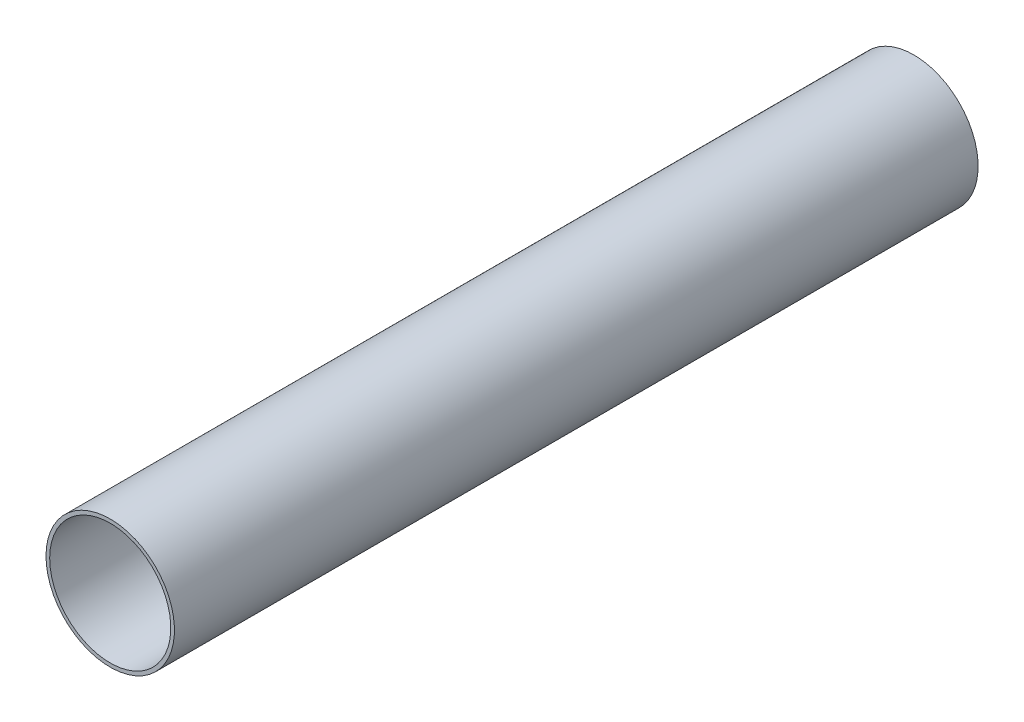
ISO-10303-21;
HEADER;
FILE_DESCRIPTION(('STEP AP214'),'2;1');
FILE_NAME('part.step','',(''),(''),'','','');
FILE_SCHEMA(('AUTOMOTIVE_DESIGN { 1 0 10303 214 1 1 1 1 }'));
ENDSEC;
DATA;
#1=APPLICATION_CONTEXT('core data for automotive mechanical design processes');
#2=APPLICATION_PROTOCOL_DEFINITION('international standard','automotive_design',2000,#1);
#3=PRODUCT_CONTEXT('',#1,'mechanical');
#4=PRODUCT('Part','Part','',(#3));
#5=PRODUCT_RELATED_PRODUCT_CATEGORY('part','',(#4));
#6=PRODUCT_DEFINITION_FORMATION('','',#4);
#7=PRODUCT_DEFINITION_CONTEXT('part definition',#1,'design');
#8=PRODUCT_DEFINITION('design','',#6,#7);
#9=PRODUCT_DEFINITION_SHAPE('','',#8);
#10=(LENGTH_UNIT() NAMED_UNIT(*) SI_UNIT(.MILLI.,.METRE.));
#11=(NAMED_UNIT(*) PLANE_ANGLE_UNIT() SI_UNIT($,.RADIAN.));
#12=(NAMED_UNIT(*) SI_UNIT($,.STERADIAN.) SOLID_ANGLE_UNIT());
#13=UNCERTAINTY_MEASURE_WITH_UNIT(LENGTH_MEASURE(1.E-05),#10,'distance_accuracy_value','');
#14=(GEOMETRIC_REPRESENTATION_CONTEXT(3) GLOBAL_UNCERTAINTY_ASSIGNED_CONTEXT((#13)) GLOBAL_UNIT_ASSIGNED_CONTEXT((#10,
#11,#12)) REPRESENTATION_CONTEXT('',''));
#15=CARTESIAN_POINT('',(0.,0.,0.));
#16=DIRECTION('',(0.,0.,1.));
#17=DIRECTION('',(1.,0.,0.));
#18=AXIS2_PLACEMENT_3D('',#15,#16,#17);
#19=CARTESIAN_POINT('',(0.,0.,438.));
#20=DIRECTION('',(0.,0.,1.));
#21=DIRECTION('',(1.,0.,0.));
#22=AXIS2_PLACEMENT_3D('',#19,#20,#21);
#23=PLANE('',#22);
#24=CARTESIAN_POINT('',(0.,0.,438.));
#25=DIRECTION('',(0.,0.,1.));
#26=DIRECTION('',(1.,0.,0.));
#27=AXIS2_PLACEMENT_3D('',#24,#25,#26);
#28=CIRCLE('',#27,35.);
#29=CARTESIAN_POINT('',(-35.,0.,438.));
#30=VERTEX_POINT('',#29);
#31=EDGE_CURVE('E10',#30,#30,#28,.T.);
#32=ORIENTED_EDGE('',*,*,#31,.T.);
#33=EDGE_LOOP('',(#32));
#34=FACE_BOUND('',#33,.T.);
#35=CARTESIAN_POINT('',(0.,0.,438.));
#36=DIRECTION('',(0.,0.,1.));
#37=DIRECTION('',(1.,0.,0.));
#38=AXIS2_PLACEMENT_3D('',#35,#36,#37);
#39=CIRCLE('',#38,33.);
#40=CARTESIAN_POINT('',(-33.,0.,438.));
#41=VERTEX_POINT('',#40);
#42=EDGE_CURVE('E52',#41,#41,#39,.T.);
#43=ORIENTED_EDGE('',*,*,#42,.F.);
#44=EDGE_LOOP('',(#43));
#45=FACE_BOUND('',#44,.T.);
#46=ADVANCED_FACE('F39',(#34,#45),#23,.T.);
#47=CARTESIAN_POINT('',(0.,0.,0.));
#48=DIRECTION('',(0.,0.,1.));
#49=DIRECTION('',(1.,0.,0.));
#50=AXIS2_PLACEMENT_3D('',#47,#48,#49);
#51=PLANE('',#50);
#52=CARTESIAN_POINT('',(0.,0.,0.));
#53=DIRECTION('',(0.,0.,1.));
#54=DIRECTION('',(1.,0.,0.));
#55=AXIS2_PLACEMENT_3D('',#52,#53,#54);
#56=CIRCLE('',#55,35.);
#57=CARTESIAN_POINT('',(-35.,0.,0.));
#58=VERTEX_POINT('',#57);
#59=EDGE_CURVE('E43',#58,#58,#56,.T.);
#60=ORIENTED_EDGE('',*,*,#59,.F.);
#61=EDGE_LOOP('',(#60));
#62=FACE_BOUND('',#61,.T.);
#63=CARTESIAN_POINT('',(0.,0.,0.));
#64=DIRECTION('',(0.,0.,1.));
#65=DIRECTION('',(1.,0.,0.));
#66=AXIS2_PLACEMENT_3D('',#63,#64,#65);
#67=CIRCLE('',#66,33.);
#68=CARTESIAN_POINT('',(-33.,0.,0.));
#69=VERTEX_POINT('',#68);
#70=EDGE_CURVE('E54',#69,#69,#67,.T.);
#71=ORIENTED_EDGE('',*,*,#70,.T.);
#72=EDGE_LOOP('',(#71));
#73=FACE_BOUND('',#72,.T.);
#74=ADVANCED_FACE('F66',(#62,#73),#51,.F.);
#75=CARTESIAN_POINT('',(0.,0.,438.));
#76=DIRECTION('',(0.,0.,-1.));
#77=DIRECTION('',(-1.,0.,0.));
#78=AXIS2_PLACEMENT_3D('',#75,#76,#77);
#79=CYLINDRICAL_SURFACE('',#78,35.);
#80=CARTESIAN_POINT('',(-35.,0.,438.));
#81=CARTESIAN_POINT('',(-35.,0.,433.4375));
#82=CARTESIAN_POINT('',(-35.,0.,428.875));
#83=CARTESIAN_POINT('',(-35.,0.,419.75));
#84=CARTESIAN_POINT('',(-35.,0.,415.1875));
#85=CARTESIAN_POINT('',(-35.,0.,406.0625));
#86=CARTESIAN_POINT('',(-35.,0.,401.5));
#87=CARTESIAN_POINT('',(-35.,0.,392.375));
#88=CARTESIAN_POINT('',(-35.,0.,387.8125));
#89=CARTESIAN_POINT('',(-35.,0.,378.6875));
#90=CARTESIAN_POINT('',(-35.,0.,374.125));
#91=CARTESIAN_POINT('',(-35.,0.,365.));
#92=CARTESIAN_POINT('',(-35.,0.,360.4375));
#93=CARTESIAN_POINT('',(-35.,0.,351.3125));
#94=CARTESIAN_POINT('',(-35.,0.,346.75));
#95=CARTESIAN_POINT('',(-35.,0.,337.625));
#96=CARTESIAN_POINT('',(-35.,0.,333.0625));
#97=CARTESIAN_POINT('',(-35.,0.,323.9375));
#98=CARTESIAN_POINT('',(-35.,0.,319.375));
#99=CARTESIAN_POINT('',(-35.,0.,310.25));
#100=CARTESIAN_POINT('',(-35.,0.,305.6875));
#101=CARTESIAN_POINT('',(-35.,0.,296.5625));
#102=CARTESIAN_POINT('',(-35.,0.,292.));
#103=CARTESIAN_POINT('',(-35.,0.,282.875));
#104=CARTESIAN_POINT('',(-35.,0.,278.3125));
#105=CARTESIAN_POINT('',(-35.,0.,269.1875));
#106=CARTESIAN_POINT('',(-35.,0.,264.625));
#107=CARTESIAN_POINT('',(-35.,0.,255.5));
#108=CARTESIAN_POINT('',(-35.,0.,250.9375));
#109=CARTESIAN_POINT('',(-35.,0.,241.8125));
#110=CARTESIAN_POINT('',(-35.,0.,237.25));
#111=CARTESIAN_POINT('',(-35.,0.,228.125));
#112=CARTESIAN_POINT('',(-35.,0.,223.5625));
#113=CARTESIAN_POINT('',(-35.,0.,214.4375));
#114=CARTESIAN_POINT('',(-35.,0.,209.875));
#115=CARTESIAN_POINT('',(-35.,0.,200.75));
#116=CARTESIAN_POINT('',(-35.,0.,196.1875));
#117=CARTESIAN_POINT('',(-35.,0.,187.0625));
#118=CARTESIAN_POINT('',(-35.,0.,182.5));
#119=CARTESIAN_POINT('',(-35.,0.,173.375));
#120=CARTESIAN_POINT('',(-35.,0.,168.8125));
#121=CARTESIAN_POINT('',(-35.,0.,159.6875));
#122=CARTESIAN_POINT('',(-35.,0.,155.125));
#123=CARTESIAN_POINT('',(-35.,0.,146.));
#124=CARTESIAN_POINT('',(-35.,0.,141.4375));
#125=CARTESIAN_POINT('',(-35.,0.,132.3125));
#126=CARTESIAN_POINT('',(-35.,0.,127.75));
#127=CARTESIAN_POINT('',(-35.,0.,118.625));
#128=CARTESIAN_POINT('',(-35.,0.,114.0625));
#129=CARTESIAN_POINT('',(-35.,0.,104.9375));
#130=CARTESIAN_POINT('',(-35.,0.,100.375));
#131=CARTESIAN_POINT('',(-35.,0.,91.25));
#132=CARTESIAN_POINT('',(-35.,0.,86.6875));
#133=CARTESIAN_POINT('',(-35.,0.,77.5624999999999));
#134=CARTESIAN_POINT('',(-35.,0.,72.9999999999999));
#135=CARTESIAN_POINT('',(-35.,0.,63.8749999999999));
#136=CARTESIAN_POINT('',(-35.,0.,59.3125));
#137=CARTESIAN_POINT('',(-35.,0.,50.1875));
#138=CARTESIAN_POINT('',(-35.,0.,45.625));
#139=CARTESIAN_POINT('',(-35.,0.,36.4999999999999));
#140=CARTESIAN_POINT('',(-35.,0.,31.9374999999999));
#141=CARTESIAN_POINT('',(-35.,0.,22.8124999999999));
#142=CARTESIAN_POINT('',(-35.,0.,18.25));
#143=CARTESIAN_POINT('',(-35.,0.,9.12499999999995));
#144=CARTESIAN_POINT('',(-35.,0.,4.56249999999994));
#145=CARTESIAN_POINT('',(-35.,0.,0.));
#146=B_SPLINE_CURVE_WITH_KNOTS('',3,(#80,#81,#82,#83,#84,#85,#86,#87,#88,#89,#90,#91,#92,#93,
#94,#95,#96,#97,#98,#99,#100,#101,#102,#103,#104,#105,#106,#107,#108,#109,#110,#111,#112,#113,
#114,#115,#116,#117,#118,#119,#120,#121,#122,#123,#124,#125,#126,#127,#128,#129,#130,#131,#132,
#133,#134,#135,#136,#137,#138,#139,#140,#141,#142,#143,#144,#145),.UNSPECIFIED.,.F.,.F.,(4,2,2,
2,2,2,2,2,2,2,2,2,2,2,2,2,2,2,2,2,2,2,2,2,2,2,2,2,2,2,2,2,4),(0.,13.6875,27.375,41.0625,54.75,
68.4375,82.125,95.8125,109.5,123.1875,136.875,150.5625,164.25,177.9375,191.625,205.3125,219.,
232.6875,246.375,260.0625,273.75,287.4375,301.125,314.8125,328.5,342.1875,355.875,369.5625,
383.25,396.9375,410.625,424.3125,438.),.UNSPECIFIED.);
#147=EDGE_CURVE('BSEAM41',#30,#58,#146,.T.);
#148=ORIENTED_EDGE('',*,*,#31,.F.);
#149=ORIENTED_EDGE('',*,*,#59,.T.);
#150=ORIENTED_EDGE('',*,*,#147,.T.);
#151=ORIENTED_EDGE('',*,*,#147,.F.);
#152=EDGE_LOOP('',(#148,#150,#149,#151));
#153=FACE_BOUND('',#152,.T.);
#154=ADVANCED_FACE('F41',(#153),#79,.T.);
#155=CARTESIAN_POINT('',(0.,0.,438.));
#156=DIRECTION('',(0.,0.,-1.));
#157=DIRECTION('',(-1.,0.,0.));
#158=AXIS2_PLACEMENT_3D('',#155,#156,#157);
#159=CYLINDRICAL_SURFACE('',#158,33.);
#160=CARTESIAN_POINT('',(-33.,0.,438.));
#161=CARTESIAN_POINT('',(-33.,0.,433.4375));
#162=CARTESIAN_POINT('',(-33.,0.,428.875));
#163=CARTESIAN_POINT('',(-33.,0.,419.75));
#164=CARTESIAN_POINT('',(-33.,0.,415.1875));
#165=CARTESIAN_POINT('',(-33.,0.,406.0625));
#166=CARTESIAN_POINT('',(-33.,0.,401.5));
#167=CARTESIAN_POINT('',(-33.,0.,392.375));
#168=CARTESIAN_POINT('',(-33.,0.,387.8125));
#169=CARTESIAN_POINT('',(-33.,0.,378.6875));
#170=CARTESIAN_POINT('',(-33.,0.,374.125));
#171=CARTESIAN_POINT('',(-33.,0.,365.));
#172=CARTESIAN_POINT('',(-33.,0.,360.4375));
#173=CARTESIAN_POINT('',(-33.,0.,351.3125));
#174=CARTESIAN_POINT('',(-33.,0.,346.75));
#175=CARTESIAN_POINT('',(-33.,0.,337.625));
#176=CARTESIAN_POINT('',(-33.,0.,333.0625));
#177=CARTESIAN_POINT('',(-33.,0.,323.9375));
#178=CARTESIAN_POINT('',(-33.,0.,319.375));
#179=CARTESIAN_POINT('',(-33.,0.,310.25));
#180=CARTESIAN_POINT('',(-33.,0.,305.6875));
#181=CARTESIAN_POINT('',(-33.,0.,296.5625));
#182=CARTESIAN_POINT('',(-33.,0.,292.));
#183=CARTESIAN_POINT('',(-33.,0.,282.875));
#184=CARTESIAN_POINT('',(-33.,0.,278.3125));
#185=CARTESIAN_POINT('',(-33.,0.,269.1875));
#186=CARTESIAN_POINT('',(-33.,0.,264.625));
#187=CARTESIAN_POINT('',(-33.,0.,255.5));
#188=CARTESIAN_POINT('',(-33.,0.,250.9375));
#189=CARTESIAN_POINT('',(-33.,0.,241.8125));
#190=CARTESIAN_POINT('',(-33.,0.,237.25));
#191=CARTESIAN_POINT('',(-33.,0.,228.125));
#192=CARTESIAN_POINT('',(-33.,0.,223.5625));
#193=CARTESIAN_POINT('',(-33.,0.,214.4375));
#194=CARTESIAN_POINT('',(-33.,0.,209.875));
#195=CARTESIAN_POINT('',(-33.,0.,200.75));
#196=CARTESIAN_POINT('',(-33.,0.,196.1875));
#197=CARTESIAN_POINT('',(-33.,0.,187.0625));
#198=CARTESIAN_POINT('',(-33.,0.,182.5));
#199=CARTESIAN_POINT('',(-33.,0.,173.375));
#200=CARTESIAN_POINT('',(-33.,0.,168.8125));
#201=CARTESIAN_POINT('',(-33.,0.,159.6875));
#202=CARTESIAN_POINT('',(-33.,0.,155.125));
#203=CARTESIAN_POINT('',(-33.,0.,146.));
#204=CARTESIAN_POINT('',(-33.,0.,141.4375));
#205=CARTESIAN_POINT('',(-33.,0.,132.3125));
#206=CARTESIAN_POINT('',(-33.,0.,127.75));
#207=CARTESIAN_POINT('',(-33.,0.,118.625));
#208=CARTESIAN_POINT('',(-33.,0.,114.0625));
#209=CARTESIAN_POINT('',(-33.,0.,104.9375));
#210=CARTESIAN_POINT('',(-33.,0.,100.375));
#211=CARTESIAN_POINT('',(-33.,0.,91.25));
#212=CARTESIAN_POINT('',(-33.,0.,86.6875));
#213=CARTESIAN_POINT('',(-33.,0.,77.5624999999999));
#214=CARTESIAN_POINT('',(-33.,0.,72.9999999999999));
#215=CARTESIAN_POINT('',(-33.,0.,63.8749999999999));
#216=CARTESIAN_POINT('',(-33.,0.,59.3125));
#217=CARTESIAN_POINT('',(-33.,0.,50.1875));
#218=CARTESIAN_POINT('',(-33.,0.,45.625));
#219=CARTESIAN_POINT('',(-33.,0.,36.4999999999999));
#220=CARTESIAN_POINT('',(-33.,0.,31.9374999999999));
#221=CARTESIAN_POINT('',(-33.,0.,22.8124999999999));
#222=CARTESIAN_POINT('',(-33.,0.,18.25));
#223=CARTESIAN_POINT('',(-33.,0.,9.12499999999995));
#224=CARTESIAN_POINT('',(-33.,0.,4.56249999999994));
#225=CARTESIAN_POINT('',(-33.,0.,0.));
#226=B_SPLINE_CURVE_WITH_KNOTS('',3,(#160,#161,#162,#163,#164,#165,#166,#167,#168,#169,#170,
#171,#172,#173,#174,#175,#176,#177,#178,#179,#180,#181,#182,#183,#184,#185,#186,#187,#188,#189,
#190,#191,#192,#193,#194,#195,#196,#197,#198,#199,#200,#201,#202,#203,#204,#205,#206,#207,#208,
#209,#210,#211,#212,#213,#214,#215,#216,#217,#218,#219,#220,#221,#222,#223,#224,#225),
.UNSPECIFIED.,.F.,.F.,(4,2,2,2,2,2,2,2,2,2,2,2,2,2,2,2,2,2,2,2,2,2,2,2,2,2,2,2,2,2,2,2,4),(0.,
13.6875,27.375,41.0625,54.75,68.4375,82.125,95.8125,109.5,123.1875,136.875,150.5625,164.25,
177.9375,191.625,205.3125,219.,232.6875,246.375,260.0625,273.75,287.4375,301.125,314.8125,328.5,
342.1875,355.875,369.5625,383.25,396.9375,410.625,424.3125,438.),.UNSPECIFIED.);
#227=EDGE_CURVE('BSEAM62',#41,#69,#226,.T.);
#228=ORIENTED_EDGE('',*,*,#42,.T.);
#229=ORIENTED_EDGE('',*,*,#70,.F.);
#230=ORIENTED_EDGE('',*,*,#227,.T.);
#231=ORIENTED_EDGE('',*,*,#227,.F.);
#232=EDGE_LOOP('',(#228,#230,#229,#231));
#233=FACE_BOUND('',#232,.T.);
#234=ADVANCED_FACE('F62',(#233),#159,.F.);
#235=CLOSED_SHELL('',(#46,#74,#154,#234));
#236=MANIFOLD_SOLID_BREP('B2',#235);
#237=ADVANCED_BREP_SHAPE_REPRESENTATION('',(#18,#236),#14);
#238=SHAPE_DEFINITION_REPRESENTATION(#9,#237);
ENDSEC;
END-ISO-10303-21;
